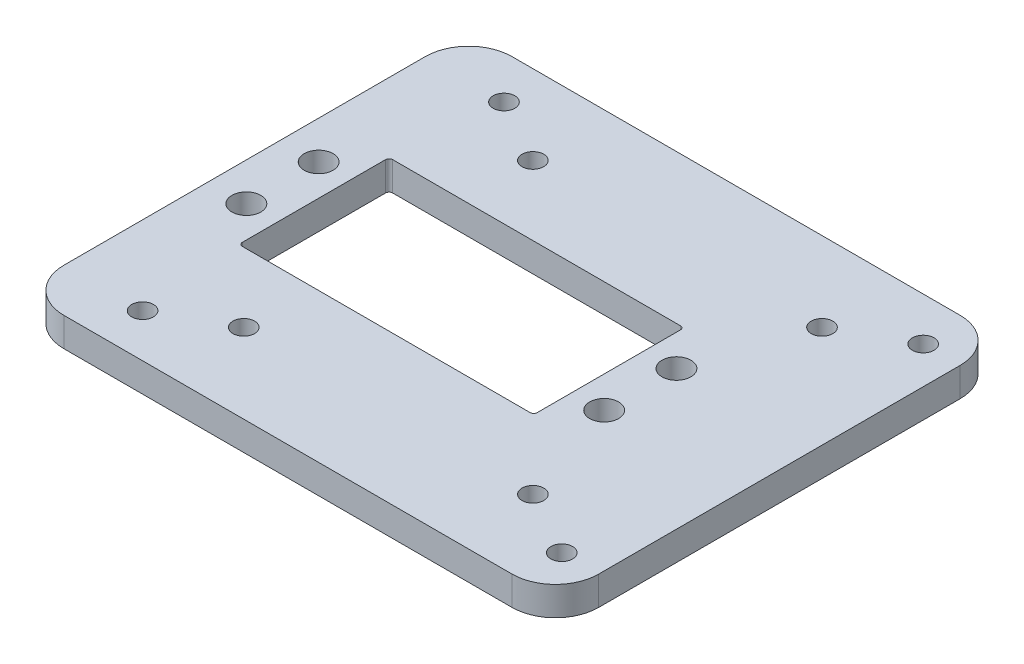
ISO-10303-21;
HEADER;
FILE_DESCRIPTION(('STEP AP214'),'2;1');
FILE_NAME('part.step','',(''),(''),'','','');
FILE_SCHEMA(('AUTOMOTIVE_DESIGN { 1 0 10303 214 1 1 1 1 }'));
ENDSEC;
DATA;
#1=APPLICATION_CONTEXT('core data for automotive mechanical design processes');
#2=APPLICATION_PROTOCOL_DEFINITION('international standard','automotive_design',2000,#1);
#3=PRODUCT_CONTEXT('',#1,'mechanical');
#4=PRODUCT('Part','Part','',(#3));
#5=PRODUCT_RELATED_PRODUCT_CATEGORY('part','',(#4));
#6=PRODUCT_DEFINITION_FORMATION('','',#4);
#7=PRODUCT_DEFINITION_CONTEXT('part definition',#1,'design');
#8=PRODUCT_DEFINITION('design','',#6,#7);
#9=PRODUCT_DEFINITION_SHAPE('','',#8);
#10=(LENGTH_UNIT() NAMED_UNIT(*) SI_UNIT(.MILLI.,.METRE.));
#11=(NAMED_UNIT(*) PLANE_ANGLE_UNIT() SI_UNIT($,.RADIAN.));
#12=(NAMED_UNIT(*) SI_UNIT($,.STERADIAN.) SOLID_ANGLE_UNIT());
#13=UNCERTAINTY_MEASURE_WITH_UNIT(LENGTH_MEASURE(1.E-05),#10,'distance_accuracy_value','');
#14=(GEOMETRIC_REPRESENTATION_CONTEXT(3) GLOBAL_UNCERTAINTY_ASSIGNED_CONTEXT((#13)) GLOBAL_UNIT_ASSIGNED_CONTEXT((#10,
#11,#12)) REPRESENTATION_CONTEXT('',''));
#15=CARTESIAN_POINT('',(0.,0.,0.));
#16=DIRECTION('',(0.,0.,1.));
#17=DIRECTION('',(1.,0.,0.));
#18=AXIS2_PLACEMENT_3D('',#15,#16,#17);
#19=CARTESIAN_POINT('',(20.4,4.,0.));
#20=DIRECTION('',(-1.,0.,0.));
#21=DIRECTION('',(0.,0.,1.));
#22=AXIS2_PLACEMENT_3D('',#19,#20,#21);
#23=PLANE('',#22);
#24=DIRECTION('',(0.,0.,-1.));
#25=VECTOR('',#24,1.);
#26=CARTESIAN_POINT('',(20.4,0.,0.));
#27=LINE('',#26,#25);
#28=CARTESIAN_POINT('',(20.4,0.,9.9));
#29=VERTEX_POINT('',#28);
#30=CARTESIAN_POINT('',(20.4,0.,-9.9));
#31=VERTEX_POINT('',#30);
#32=EDGE_CURVE('E179',#29,#31,#27,.T.);
#33=ORIENTED_EDGE('',*,*,#32,.F.);
#34=DIRECTION('',(0.,-1.,0.));
#35=VECTOR('',#34,1.);
#36=CARTESIAN_POINT('',(20.4,4.,9.9));
#37=LINE('',#36,#35);
#38=CARTESIAN_POINT('',(20.4,4.,9.9));
#39=VERTEX_POINT('',#38);
#40=EDGE_CURVE('E196',#29,#39,#37,.F.);
#41=ORIENTED_EDGE('',*,*,#40,.T.);
#42=DIRECTION('',(0.,0.,-1.));
#43=VECTOR('',#42,1.);
#44=CARTESIAN_POINT('',(20.4,4.,0.));
#45=LINE('',#44,#43);
#46=CARTESIAN_POINT('',(20.4,4.,-9.9));
#47=VERTEX_POINT('',#46);
#48=EDGE_CURVE('E338',#39,#47,#45,.T.);
#49=ORIENTED_EDGE('',*,*,#48,.T.);
#50=DIRECTION('',(0.,-1.,0.));
#51=VECTOR('',#50,1.);
#52=CARTESIAN_POINT('',(20.4,4.,-9.9));
#53=LINE('',#52,#51);
#54=EDGE_CURVE('E185',#47,#31,#53,.T.);
#55=ORIENTED_EDGE('',*,*,#54,.T.);
#56=EDGE_LOOP('',(#33,#41,#49,#55));
#57=FACE_BOUND('',#56,.T.);
#58=ADVANCED_FACE('F43',(#57),#23,.T.);
#59=CARTESIAN_POINT('',(0.,4.,10.4));
#60=DIRECTION('',(0.,0.,-1.));
#61=DIRECTION('',(-1.,0.,0.));
#62=AXIS2_PLACEMENT_3D('',#59,#60,#61);
#63=PLANE('',#62);
#64=DIRECTION('',(1.,0.,0.));
#65=VECTOR('',#64,1.);
#66=CARTESIAN_POINT('',(0.,4.,10.4));
#67=LINE('',#66,#65);
#68=CARTESIAN_POINT('',(-19.9,4.,10.4));
#69=VERTEX_POINT('',#68);
#70=CARTESIAN_POINT('',(19.9,4.,10.4));
#71=VERTEX_POINT('',#70);
#72=EDGE_CURVE('E341',#69,#71,#67,.T.);
#73=ORIENTED_EDGE('',*,*,#72,.T.);
#74=DIRECTION('',(0.,-1.,0.));
#75=VECTOR('',#74,1.);
#76=CARTESIAN_POINT('',(19.9,0.,10.4));
#77=LINE('',#76,#75);
#78=CARTESIAN_POINT('',(19.9,0.,10.4));
#79=VERTEX_POINT('',#78);
#80=EDGE_CURVE('E178',#71,#79,#77,.T.);
#81=ORIENTED_EDGE('',*,*,#80,.T.);
#82=DIRECTION('',(1.,0.,0.));
#83=VECTOR('',#82,1.);
#84=CARTESIAN_POINT('',(0.,0.,10.4));
#85=LINE('',#84,#83);
#86=CARTESIAN_POINT('',(-19.9,0.,10.4));
#87=VERTEX_POINT('',#86);
#88=EDGE_CURVE('E161',#87,#79,#85,.T.);
#89=ORIENTED_EDGE('',*,*,#88,.F.);
#90=DIRECTION('',(0.,-1.,0.));
#91=VECTOR('',#90,1.);
#92=CARTESIAN_POINT('',(-19.9,4.,10.4));
#93=LINE('',#92,#91);
#94=EDGE_CURVE('E175',#87,#69,#93,.F.);
#95=ORIENTED_EDGE('',*,*,#94,.T.);
#96=EDGE_LOOP('',(#73,#81,#89,#95));
#97=FACE_BOUND('',#96,.T.);
#98=ADVANCED_FACE('F174',(#97),#63,.T.);
#99=CARTESIAN_POINT('',(-20.4,4.,0.));
#100=DIRECTION('',(-1.,0.,0.));
#101=DIRECTION('',(0.,0.,1.));
#102=AXIS2_PLACEMENT_3D('',#99,#100,#101);
#103=PLANE('',#102);
#104=DIRECTION('',(0.,0.,-1.));
#105=VECTOR('',#104,1.);
#106=CARTESIAN_POINT('',(-20.4,4.,0.));
#107=LINE('',#106,#105);
#108=CARTESIAN_POINT('',(-20.4,4.,9.9));
#109=VERTEX_POINT('',#108);
#110=CARTESIAN_POINT('',(-20.4,4.,-9.9));
#111=VERTEX_POINT('',#110);
#112=EDGE_CURVE('E343',#109,#111,#107,.T.);
#113=ORIENTED_EDGE('',*,*,#112,.F.);
#114=DIRECTION('',(0.,-1.,0.));
#115=VECTOR('',#114,1.);
#116=CARTESIAN_POINT('',(-20.4,4.,9.9));
#117=LINE('',#116,#115);
#118=CARTESIAN_POINT('',(-20.4,0.,9.9));
#119=VERTEX_POINT('',#118);
#120=EDGE_CURVE('E200',#109,#119,#117,.T.);
#121=ORIENTED_EDGE('',*,*,#120,.T.);
#122=DIRECTION('',(0.,0.,-1.));
#123=VECTOR('',#122,1.);
#124=CARTESIAN_POINT('',(-20.4,0.,0.));
#125=LINE('',#124,#123);
#126=CARTESIAN_POINT('',(-20.4,0.,-9.9));
#127=VERTEX_POINT('',#126);
#128=EDGE_CURVE('E163',#119,#127,#125,.T.);
#129=ORIENTED_EDGE('',*,*,#128,.T.);
#130=DIRECTION('',(0.,-1.,0.));
#131=VECTOR('',#130,1.);
#132=CARTESIAN_POINT('',(-20.4,4.,-9.9));
#133=LINE('',#132,#131);
#134=EDGE_CURVE('E198',#127,#111,#133,.F.);
#135=ORIENTED_EDGE('',*,*,#134,.T.);
#136=EDGE_LOOP('',(#113,#121,#129,#135));
#137=FACE_BOUND('',#136,.T.);
#138=ADVANCED_FACE('F407',(#137),#103,.F.);
#139=CARTESIAN_POINT('',(44.,4.,0.));
#140=DIRECTION('',(1.,0.,0.));
#141=DIRECTION('',(0.,0.,-1.));
#142=AXIS2_PLACEMENT_3D('',#139,#140,#141);
#143=PLANE('',#142);
#144=DIRECTION('',(0.,0.,1.));
#145=VECTOR('',#144,1.);
#146=CARTESIAN_POINT('',(44.,0.,0.));
#147=LINE('',#146,#145);
#148=CARTESIAN_POINT('',(44.,0.,-25.));
#149=VERTEX_POINT('',#148);
#150=CARTESIAN_POINT('',(44.,0.,25.));
#151=VERTEX_POINT('',#150);
#152=EDGE_CURVE('E269',#149,#151,#147,.T.);
#153=ORIENTED_EDGE('',*,*,#152,.F.);
#154=DIRECTION('',(0.,-1.,0.));
#155=VECTOR('',#154,1.);
#156=CARTESIAN_POINT('',(44.,4.,-25.));
#157=LINE('',#156,#155);
#158=CARTESIAN_POINT('',(44.,4.,-25.));
#159=VERTEX_POINT('',#158);
#160=EDGE_CURVE('E235',#149,#159,#157,.F.);
#161=ORIENTED_EDGE('',*,*,#160,.T.);
#162=DIRECTION('',(0.,0.,1.));
#163=VECTOR('',#162,1.);
#164=CARTESIAN_POINT('',(44.,4.,0.));
#165=LINE('',#164,#163);
#166=CARTESIAN_POINT('',(44.,4.,25.));
#167=VERTEX_POINT('',#166);
#168=EDGE_CURVE('E313',#159,#167,#165,.T.);
#169=ORIENTED_EDGE('',*,*,#168,.T.);
#170=DIRECTION('',(0.,-1.,0.));
#171=VECTOR('',#170,1.);
#172=CARTESIAN_POINT('',(44.,0.,25.));
#173=LINE('',#172,#171);
#174=EDGE_CURVE('E232',#167,#151,#173,.T.);
#175=ORIENTED_EDGE('',*,*,#174,.T.);
#176=EDGE_LOOP('',(#153,#161,#169,#175));
#177=FACE_BOUND('',#176,.T.);
#178=ADVANCED_FACE('F372',(#177),#143,.T.);
#179=CARTESIAN_POINT('',(0.,4.,-31.));
#180=DIRECTION('',(0.,0.,-1.));
#181=DIRECTION('',(-1.,0.,0.));
#182=AXIS2_PLACEMENT_3D('',#179,#180,#181);
#183=PLANE('',#182);
#184=DIRECTION('',(1.,0.,0.));
#185=VECTOR('',#184,1.);
#186=CARTESIAN_POINT('',(0.,4.,-31.));
#187=LINE('',#186,#185);
#188=CARTESIAN_POINT('',(-24.,4.,-31.));
#189=VERTEX_POINT('',#188);
#190=CARTESIAN_POINT('',(38.,4.,-31.));
#191=VERTEX_POINT('',#190);
#192=EDGE_CURVE('E318',#189,#191,#187,.T.);
#193=ORIENTED_EDGE('',*,*,#192,.T.);
#194=DIRECTION('',(0.,-1.,0.));
#195=VECTOR('',#194,1.);
#196=CARTESIAN_POINT('',(38.,4.,-31.));
#197=LINE('',#196,#195);
#198=CARTESIAN_POINT('',(38.,0.,-31.));
#199=VERTEX_POINT('',#198);
#200=EDGE_CURVE('E221',#191,#199,#197,.T.);
#201=ORIENTED_EDGE('',*,*,#200,.T.);
#202=DIRECTION('',(1.,0.,0.));
#203=VECTOR('',#202,1.);
#204=CARTESIAN_POINT('',(0.,0.,-31.));
#205=LINE('',#204,#203);
#206=CARTESIAN_POINT('',(-24.,0.,-31.));
#207=VERTEX_POINT('',#206);
#208=EDGE_CURVE('E265',#207,#199,#205,.T.);
#209=ORIENTED_EDGE('',*,*,#208,.F.);
#210=DIRECTION('',(0.,-1.,0.));
#211=VECTOR('',#210,1.);
#212=CARTESIAN_POINT('',(-24.,4.,-31.));
#213=LINE('',#212,#211);
#214=EDGE_CURVE('E219',#207,#189,#213,.F.);
#215=ORIENTED_EDGE('',*,*,#214,.T.);
#216=EDGE_LOOP('',(#193,#201,#209,#215));
#217=FACE_BOUND('',#216,.T.);
#218=ADVANCED_FACE('F383',(#217),#183,.T.);
#219=CARTESIAN_POINT('',(-30.,4.,0.));
#220=DIRECTION('',(-1.,0.,0.));
#221=DIRECTION('',(0.,0.,1.));
#222=AXIS2_PLACEMENT_3D('',#219,#220,#221);
#223=PLANE('',#222);
#224=DIRECTION('',(0.,0.,-1.));
#225=VECTOR('',#224,1.);
#226=CARTESIAN_POINT('',(-30.,0.,0.));
#227=LINE('',#226,#225);
#228=CARTESIAN_POINT('',(-30.,0.,25.));
#229=VERTEX_POINT('',#228);
#230=CARTESIAN_POINT('',(-30.,0.,-25.));
#231=VERTEX_POINT('',#230);
#232=EDGE_CURVE('E254',#229,#231,#227,.T.);
#233=ORIENTED_EDGE('',*,*,#232,.F.);
#234=DIRECTION('',(0.,-1.,0.));
#235=VECTOR('',#234,1.);
#236=CARTESIAN_POINT('',(-30.,4.,25.));
#237=LINE('',#236,#235);
#238=CARTESIAN_POINT('',(-30.,4.,25.));
#239=VERTEX_POINT('',#238);
#240=EDGE_CURVE('E11',#229,#239,#237,.F.);
#241=ORIENTED_EDGE('',*,*,#240,.T.);
#242=DIRECTION('',(0.,0.,-1.));
#243=VECTOR('',#242,1.);
#244=CARTESIAN_POINT('',(-30.,4.,0.));
#245=LINE('',#244,#243);
#246=CARTESIAN_POINT('',(-30.,4.,-25.));
#247=VERTEX_POINT('',#246);
#248=EDGE_CURVE('E256',#239,#247,#245,.T.);
#249=ORIENTED_EDGE('',*,*,#248,.T.);
#250=DIRECTION('',(0.,-1.,0.));
#251=VECTOR('',#250,1.);
#252=CARTESIAN_POINT('',(-30.,4.,-25.));
#253=LINE('',#252,#251);
#254=EDGE_CURVE('E51',#247,#231,#253,.T.);
#255=ORIENTED_EDGE('',*,*,#254,.T.);
#256=EDGE_LOOP('',(#233,#241,#249,#255));
#257=FACE_BOUND('',#256,.T.);
#258=ADVANCED_FACE('F253',(#257),#223,.T.);
#259=CARTESIAN_POINT('',(38.89,4.,25.));
#260=DIRECTION('',(0.,-1.,0.));
#261=DIRECTION('',(0.,0.,-1.));
#262=AXIS2_PLACEMENT_3D('',#259,#260,#261);
#263=CYLINDRICAL_SURFACE('',#262,1.5);
#264=CARTESIAN_POINT('',(38.89,4.,25.));
#265=DIRECTION('',(0.,1.,0.));
#266=DIRECTION('',(0.,0.,1.));
#267=AXIS2_PLACEMENT_3D('',#264,#265,#266);
#268=CIRCLE('',#267,1.5);
#269=CARTESIAN_POINT('',(38.89,4.,26.5));
#270=VERTEX_POINT('',#269);
#271=EDGE_CURVE('E188',#270,#270,#268,.T.);
#272=ORIENTED_EDGE('',*,*,#271,.T.);
#273=EDGE_LOOP('',(#272));
#274=FACE_BOUND('',#273,.T.);
#275=CARTESIAN_POINT('',(38.89,0.,25.));
#276=DIRECTION('',(0.,1.,0.));
#277=DIRECTION('',(0.,0.,1.));
#278=AXIS2_PLACEMENT_3D('',#275,#276,#277);
#279=CIRCLE('',#278,1.5);
#280=CARTESIAN_POINT('',(38.89,0.,26.5));
#281=VERTEX_POINT('',#280);
#282=EDGE_CURVE('E304',#281,#281,#279,.T.);
#283=ORIENTED_EDGE('',*,*,#282,.F.);
#284=EDGE_LOOP('',(#283));
#285=FACE_BOUND('',#284,.T.);
#286=ADVANCED_FACE('F434',(#274,#285),#263,.F.);
#287=CARTESIAN_POINT('',(-10.11,4.,20.));
#288=DIRECTION('',(0.,-1.,0.));
#289=DIRECTION('',(0.,0.,-1.));
#290=AXIS2_PLACEMENT_3D('',#287,#288,#289);
#291=CYLINDRICAL_SURFACE('',#290,1.5);
#292=CARTESIAN_POINT('',(-10.11,4.,20.));
#293=DIRECTION('',(0.,1.,0.));
#294=DIRECTION('',(0.,0.,1.));
#295=AXIS2_PLACEMENT_3D('',#292,#293,#294);
#296=CIRCLE('',#295,1.5);
#297=CARTESIAN_POINT('',(-10.11,4.,21.5));
#298=VERTEX_POINT('',#297);
#299=EDGE_CURVE('E361',#298,#298,#296,.F.);
#300=ORIENTED_EDGE('',*,*,#299,.F.);
#301=EDGE_LOOP('',(#300));
#302=FACE_BOUND('',#301,.T.);
#303=CARTESIAN_POINT('',(-10.11,0.,20.));
#304=DIRECTION('',(0.,1.,0.));
#305=DIRECTION('',(0.,0.,1.));
#306=AXIS2_PLACEMENT_3D('',#303,#304,#305);
#307=CIRCLE('',#306,1.5);
#308=CARTESIAN_POINT('',(-10.11,0.,21.5));
#309=VERTEX_POINT('',#308);
#310=EDGE_CURVE('E302',#309,#309,#307,.F.);
#311=ORIENTED_EDGE('',*,*,#310,.T.);
#312=EDGE_LOOP('',(#311));
#313=FACE_BOUND('',#312,.T.);
#314=ADVANCED_FACE('F494',(#302,#313),#291,.F.);
#315=CARTESIAN_POINT('',(29.89,4.,20.));
#316=DIRECTION('',(0.,-1.,0.));
#317=DIRECTION('',(0.,0.,-1.));
#318=AXIS2_PLACEMENT_3D('',#315,#316,#317);
#319=CYLINDRICAL_SURFACE('',#318,1.5);
#320=CARTESIAN_POINT('',(29.89,4.,20.));
#321=DIRECTION('',(0.,1.,0.));
#322=DIRECTION('',(0.,0.,1.));
#323=AXIS2_PLACEMENT_3D('',#320,#321,#322);
#324=CIRCLE('',#323,1.5);
#325=CARTESIAN_POINT('',(29.89,4.,21.5));
#326=VERTEX_POINT('',#325);
#327=EDGE_CURVE('E358',#326,#326,#324,.T.);
#328=ORIENTED_EDGE('',*,*,#327,.T.);
#329=EDGE_LOOP('',(#328));
#330=FACE_BOUND('',#329,.T.);
#331=CARTESIAN_POINT('',(29.89,0.,20.));
#332=DIRECTION('',(0.,1.,0.));
#333=DIRECTION('',(0.,0.,1.));
#334=AXIS2_PLACEMENT_3D('',#331,#332,#333);
#335=CIRCLE('',#334,1.5);
#336=CARTESIAN_POINT('',(29.89,0.,21.5));
#337=VERTEX_POINT('',#336);
#338=EDGE_CURVE('E299',#337,#337,#335,.T.);
#339=ORIENTED_EDGE('',*,*,#338,.F.);
#340=EDGE_LOOP('',(#339));
#341=FACE_BOUND('',#340,.T.);
#342=ADVANCED_FACE('F490',(#330,#341),#319,.F.);
#343=CARTESIAN_POINT('',(-10.11,4.,-20.));
#344=DIRECTION('',(0.,-1.,0.));
#345=DIRECTION('',(0.,0.,-1.));
#346=AXIS2_PLACEMENT_3D('',#343,#344,#345);
#347=CYLINDRICAL_SURFACE('',#346,1.5);
#348=CARTESIAN_POINT('',(-10.11,4.,-20.));
#349=DIRECTION('',(0.,1.,0.));
#350=DIRECTION('',(0.,0.,1.));
#351=AXIS2_PLACEMENT_3D('',#348,#349,#350);
#352=CIRCLE('',#351,1.5);
#353=CARTESIAN_POINT('',(-10.11,4.,-18.5));
#354=VERTEX_POINT('',#353);
#355=EDGE_CURVE('E355',#354,#354,#352,.T.);
#356=ORIENTED_EDGE('',*,*,#355,.T.);
#357=EDGE_LOOP('',(#356));
#358=FACE_BOUND('',#357,.T.);
#359=CARTESIAN_POINT('',(-10.11,0.,-20.));
#360=DIRECTION('',(0.,1.,0.));
#361=DIRECTION('',(0.,0.,1.));
#362=AXIS2_PLACEMENT_3D('',#359,#360,#361);
#363=CIRCLE('',#362,1.5);
#364=CARTESIAN_POINT('',(-10.11,0.,-18.5));
#365=VERTEX_POINT('',#364);
#366=EDGE_CURVE('E296',#365,#365,#363,.T.);
#367=ORIENTED_EDGE('',*,*,#366,.F.);
#368=EDGE_LOOP('',(#367));
#369=FACE_BOUND('',#368,.T.);
#370=ADVANCED_FACE('F486',(#358,#369),#347,.F.);
#371=CARTESIAN_POINT('',(-24.75,4.,-5.00000000000001));
#372=DIRECTION('',(0.,-1.,0.));
#373=DIRECTION('',(0.,0.,-1.));
#374=AXIS2_PLACEMENT_3D('',#371,#372,#373);
#375=CYLINDRICAL_SURFACE('',#374,2.);
#376=CARTESIAN_POINT('',(-24.75,4.,-5.00000000000001));
#377=DIRECTION('',(0.,1.,0.));
#378=DIRECTION('',(0.,0.,1.));
#379=AXIS2_PLACEMENT_3D('',#376,#377,#378);
#380=CIRCLE('',#379,2.);
#381=CARTESIAN_POINT('',(-24.75,4.,-3.));
#382=VERTEX_POINT('',#381);
#383=EDGE_CURVE('E352',#382,#382,#380,.F.);
#384=ORIENTED_EDGE('',*,*,#383,.F.);
#385=EDGE_LOOP('',(#384));
#386=FACE_BOUND('',#385,.T.);
#387=CARTESIAN_POINT('',(-24.75,0.,-5.00000000000001));
#388=DIRECTION('',(0.,1.,0.));
#389=DIRECTION('',(0.,0.,1.));
#390=AXIS2_PLACEMENT_3D('',#387,#388,#389);
#391=CIRCLE('',#390,2.);
#392=CARTESIAN_POINT('',(-24.75,0.,-3.));
#393=VERTEX_POINT('',#392);
#394=EDGE_CURVE('E293',#393,#393,#391,.F.);
#395=ORIENTED_EDGE('',*,*,#394,.T.);
#396=EDGE_LOOP('',(#395));
#397=FACE_BOUND('',#396,.T.);
#398=ADVANCED_FACE('F482',(#386,#397),#375,.F.);
#399=CARTESIAN_POINT('',(-24.75,4.,4.99999999999999));
#400=DIRECTION('',(0.,-1.,0.));
#401=DIRECTION('',(0.,0.,-1.));
#402=AXIS2_PLACEMENT_3D('',#399,#400,#401);
#403=CYLINDRICAL_SURFACE('',#402,2.);
#404=CARTESIAN_POINT('',(-24.75,4.,4.99999999999999));
#405=DIRECTION('',(0.,1.,0.));
#406=DIRECTION('',(0.,0.,1.));
#407=AXIS2_PLACEMENT_3D('',#404,#405,#406);
#408=CIRCLE('',#407,2.);
#409=CARTESIAN_POINT('',(-24.75,4.,7.));
#410=VERTEX_POINT('',#409);
#411=EDGE_CURVE('E349',#410,#410,#408,.T.);
#412=ORIENTED_EDGE('',*,*,#411,.T.);
#413=EDGE_LOOP('',(#412));
#414=FACE_BOUND('',#413,.T.);
#415=CARTESIAN_POINT('',(-24.75,0.,4.99999999999999));
#416=DIRECTION('',(0.,1.,0.));
#417=DIRECTION('',(0.,0.,1.));
#418=AXIS2_PLACEMENT_3D('',#415,#416,#417);
#419=CIRCLE('',#418,2.);
#420=CARTESIAN_POINT('',(-24.75,0.,7.));
#421=VERTEX_POINT('',#420);
#422=EDGE_CURVE('E290',#421,#421,#419,.T.);
#423=ORIENTED_EDGE('',*,*,#422,.F.);
#424=EDGE_LOOP('',(#423));
#425=FACE_BOUND('',#424,.T.);
#426=ADVANCED_FACE('F479',(#414,#425),#403,.F.);
#427=CARTESIAN_POINT('',(0.,4.,-10.4));
#428=DIRECTION('',(0.,0.,-1.));
#429=DIRECTION('',(-1.,0.,0.));
#430=AXIS2_PLACEMENT_3D('',#427,#428,#429);
#431=PLANE('',#430);
#432=DIRECTION('',(1.,0.,0.));
#433=VECTOR('',#432,1.);
#434=CARTESIAN_POINT('',(0.,0.,-10.4));
#435=LINE('',#434,#433);
#436=CARTESIAN_POINT('',(-19.9,0.,-10.4));
#437=VERTEX_POINT('',#436);
#438=CARTESIAN_POINT('',(19.9,0.,-10.4));
#439=VERTEX_POINT('',#438);
#440=EDGE_CURVE('E287',#437,#439,#435,.T.);
#441=ORIENTED_EDGE('',*,*,#440,.T.);
#442=DIRECTION('',(0.,-1.,0.));
#443=VECTOR('',#442,1.);
#444=CARTESIAN_POINT('',(19.9,4.,-10.4));
#445=LINE('',#444,#443);
#446=CARTESIAN_POINT('',(19.9,4.,-10.4));
#447=VERTEX_POINT('',#446);
#448=EDGE_CURVE('E205',#439,#447,#445,.F.);
#449=ORIENTED_EDGE('',*,*,#448,.T.);
#450=DIRECTION('',(1.,0.,0.));
#451=VECTOR('',#450,1.);
#452=CARTESIAN_POINT('',(0.,4.,-10.4));
#453=LINE('',#452,#451);
#454=CARTESIAN_POINT('',(-19.9,4.,-10.4));
#455=VERTEX_POINT('',#454);
#456=EDGE_CURVE('E346',#455,#447,#453,.T.);
#457=ORIENTED_EDGE('',*,*,#456,.F.);
#458=DIRECTION('',(0.,-1.,0.));
#459=VECTOR('',#458,1.);
#460=CARTESIAN_POINT('',(-19.9,0.,-10.4));
#461=LINE('',#460,#459);
#462=EDGE_CURVE('E202',#455,#437,#461,.T.);
#463=ORIENTED_EDGE('',*,*,#462,.T.);
#464=EDGE_LOOP('',(#441,#449,#457,#463));
#465=FACE_BOUND('',#464,.T.);
#466=ADVANCED_FACE('F416',(#465),#431,.F.);
#467=CARTESIAN_POINT('',(24.75,4.,-5.00000000000001));
#468=DIRECTION('',(0.,-1.,0.));
#469=DIRECTION('',(0.,0.,-1.));
#470=AXIS2_PLACEMENT_3D('',#467,#468,#469);
#471=CYLINDRICAL_SURFACE('',#470,2.);
#472=CARTESIAN_POINT('',(24.75,4.,-5.00000000000001));
#473=DIRECTION('',(0.,1.,0.));
#474=DIRECTION('',(0.,0.,1.));
#475=AXIS2_PLACEMENT_3D('',#472,#473,#474);
#476=CIRCLE('',#475,2.);
#477=CARTESIAN_POINT('',(24.75,4.,-3.));
#478=VERTEX_POINT('',#477);
#479=EDGE_CURVE('E335',#478,#478,#476,.T.);
#480=ORIENTED_EDGE('',*,*,#479,.T.);
#481=EDGE_LOOP('',(#480));
#482=FACE_BOUND('',#481,.T.);
#483=CARTESIAN_POINT('',(24.75,0.,-5.00000000000001));
#484=DIRECTION('',(0.,1.,0.));
#485=DIRECTION('',(0.,0.,1.));
#486=AXIS2_PLACEMENT_3D('',#483,#484,#485);
#487=CIRCLE('',#486,2.);
#488=CARTESIAN_POINT('',(24.75,0.,-3.));
#489=VERTEX_POINT('',#488);
#490=EDGE_CURVE('E281',#489,#489,#487,.T.);
#491=ORIENTED_EDGE('',*,*,#490,.F.);
#492=EDGE_LOOP('',(#491));
#493=FACE_BOUND('',#492,.T.);
#494=ADVANCED_FACE('F412',(#482,#493),#471,.F.);
#495=CARTESIAN_POINT('',(24.75,4.,4.99999999999999));
#496=DIRECTION('',(0.,-1.,0.));
#497=DIRECTION('',(0.,0.,-1.));
#498=AXIS2_PLACEMENT_3D('',#495,#496,#497);
#499=CYLINDRICAL_SURFACE('',#498,2.);
#500=CARTESIAN_POINT('',(24.75,4.,4.99999999999999));
#501=DIRECTION('',(0.,1.,0.));
#502=DIRECTION('',(0.,0.,1.));
#503=AXIS2_PLACEMENT_3D('',#500,#501,#502);
#504=CIRCLE('',#503,2.);
#505=CARTESIAN_POINT('',(24.75,4.,7.));
#506=VERTEX_POINT('',#505);
#507=EDGE_CURVE('E332',#506,#506,#504,.F.);
#508=ORIENTED_EDGE('',*,*,#507,.F.);
#509=EDGE_LOOP('',(#508));
#510=FACE_BOUND('',#509,.T.);
#511=CARTESIAN_POINT('',(24.75,0.,4.99999999999999));
#512=DIRECTION('',(0.,1.,0.));
#513=DIRECTION('',(0.,0.,1.));
#514=AXIS2_PLACEMENT_3D('',#511,#512,#513);
#515=CIRCLE('',#514,2.);
#516=CARTESIAN_POINT('',(24.75,0.,7.));
#517=VERTEX_POINT('',#516);
#518=EDGE_CURVE('E278',#517,#517,#515,.F.);
#519=ORIENTED_EDGE('',*,*,#518,.T.);
#520=EDGE_LOOP('',(#519));
#521=FACE_BOUND('',#520,.T.);
#522=ADVANCED_FACE('F415',(#510,#521),#499,.F.);
#523=CARTESIAN_POINT('',(-19.11,4.,-25.));
#524=DIRECTION('',(0.,-1.,0.));
#525=DIRECTION('',(0.,0.,-1.));
#526=AXIS2_PLACEMENT_3D('',#523,#524,#525);
#527=CYLINDRICAL_SURFACE('',#526,1.5);
#528=CARTESIAN_POINT('',(-19.11,4.,-25.));
#529=DIRECTION('',(0.,1.,0.));
#530=DIRECTION('',(0.,0.,1.));
#531=AXIS2_PLACEMENT_3D('',#528,#529,#530);
#532=CIRCLE('',#531,1.5);
#533=CARTESIAN_POINT('',(-19.11,4.,-23.5));
#534=VERTEX_POINT('',#533);
#535=EDGE_CURVE('E329',#534,#534,#532,.T.);
#536=ORIENTED_EDGE('',*,*,#535,.T.);
#537=EDGE_LOOP('',(#536));
#538=FACE_BOUND('',#537,.T.);
#539=CARTESIAN_POINT('',(-19.11,0.,-25.));
#540=DIRECTION('',(0.,1.,0.));
#541=DIRECTION('',(0.,0.,1.));
#542=AXIS2_PLACEMENT_3D('',#539,#540,#541);
#543=CIRCLE('',#542,1.5);
#544=CARTESIAN_POINT('',(-19.11,0.,-23.5));
#545=VERTEX_POINT('',#544);
#546=EDGE_CURVE('E275',#545,#545,#543,.T.);
#547=ORIENTED_EDGE('',*,*,#546,.F.);
#548=EDGE_LOOP('',(#547));
#549=FACE_BOUND('',#548,.T.);
#550=ADVANCED_FACE('F420',(#538,#549),#527,.F.);
#551=CARTESIAN_POINT('',(-19.11,4.,25.));
#552=DIRECTION('',(0.,-1.,0.));
#553=DIRECTION('',(0.,0.,-1.));
#554=AXIS2_PLACEMENT_3D('',#551,#552,#553);
#555=CYLINDRICAL_SURFACE('',#554,1.5);
#556=CARTESIAN_POINT('',(-19.11,4.,25.));
#557=DIRECTION('',(0.,1.,0.));
#558=DIRECTION('',(0.,0.,1.));
#559=AXIS2_PLACEMENT_3D('',#556,#557,#558);
#560=CIRCLE('',#559,1.5);
#561=CARTESIAN_POINT('',(-19.11,4.,26.5));
#562=VERTEX_POINT('',#561);
#563=EDGE_CURVE('E326',#562,#562,#560,.F.);
#564=ORIENTED_EDGE('',*,*,#563,.F.);
#565=EDGE_LOOP('',(#564));
#566=FACE_BOUND('',#565,.T.);
#567=CARTESIAN_POINT('',(-19.11,0.,25.));
#568=DIRECTION('',(0.,1.,0.));
#569=DIRECTION('',(0.,0.,1.));
#570=AXIS2_PLACEMENT_3D('',#567,#568,#569);
#571=CIRCLE('',#570,1.5);
#572=CARTESIAN_POINT('',(-19.11,0.,26.5));
#573=VERTEX_POINT('',#572);
#574=EDGE_CURVE('E267',#573,#573,#571,.F.);
#575=ORIENTED_EDGE('',*,*,#574,.T.);
#576=EDGE_LOOP('',(#575));
#577=FACE_BOUND('',#576,.T.);
#578=ADVANCED_FACE('F424',(#566,#577),#555,.F.);
#579=CARTESIAN_POINT('',(0.,4.,31.));
#580=DIRECTION('',(0.,0.,-1.));
#581=DIRECTION('',(-1.,0.,0.));
#582=AXIS2_PLACEMENT_3D('',#579,#580,#581);
#583=PLANE('',#582);
#584=DIRECTION('',(1.,0.,0.));
#585=VECTOR('',#584,1.);
#586=CARTESIAN_POINT('',(0.,0.,31.));
#587=LINE('',#586,#585);
#588=CARTESIAN_POINT('',(-24.,0.,31.));
#589=VERTEX_POINT('',#588);
#590=CARTESIAN_POINT('',(38.,0.,31.));
#591=VERTEX_POINT('',#590);
#592=EDGE_CURVE('E264',#589,#591,#587,.T.);
#593=ORIENTED_EDGE('',*,*,#592,.T.);
#594=DIRECTION('',(0.,-1.,0.));
#595=VECTOR('',#594,1.);
#596=CARTESIAN_POINT('',(38.,4.,31.));
#597=LINE('',#596,#595);
#598=CARTESIAN_POINT('',(38.,4.,31.));
#599=VERTEX_POINT('',#598);
#600=EDGE_CURVE('E58',#591,#599,#597,.F.);
#601=ORIENTED_EDGE('',*,*,#600,.T.);
#602=DIRECTION('',(1.,0.,0.));
#603=VECTOR('',#602,1.);
#604=CARTESIAN_POINT('',(0.,4.,31.));
#605=LINE('',#604,#603);
#606=CARTESIAN_POINT('',(-24.,4.,31.));
#607=VERTEX_POINT('',#606);
#608=EDGE_CURVE('E324',#607,#599,#605,.T.);
#609=ORIENTED_EDGE('',*,*,#608,.F.);
#610=DIRECTION('',(0.,-1.,0.));
#611=VECTOR('',#610,1.);
#612=CARTESIAN_POINT('',(-24.,0.,31.));
#613=LINE('',#612,#611);
#614=EDGE_CURVE('E244',#607,#589,#613,.T.);
#615=ORIENTED_EDGE('',*,*,#614,.T.);
#616=EDGE_LOOP('',(#593,#601,#609,#615));
#617=FACE_BOUND('',#616,.T.);
#618=ADVANCED_FACE('F388',(#617),#583,.F.);
#619=CARTESIAN_POINT('',(29.89,4.,-20.));
#620=DIRECTION('',(0.,-1.,0.));
#621=DIRECTION('',(0.,0.,-1.));
#622=AXIS2_PLACEMENT_3D('',#619,#620,#621);
#623=CYLINDRICAL_SURFACE('',#622,1.5);
#624=CARTESIAN_POINT('',(29.89,4.,-20.));
#625=DIRECTION('',(0.,1.,0.));
#626=DIRECTION('',(0.,0.,1.));
#627=AXIS2_PLACEMENT_3D('',#624,#625,#626);
#628=CIRCLE('',#627,1.5);
#629=CARTESIAN_POINT('',(29.89,4.,-18.5));
#630=VERTEX_POINT('',#629);
#631=EDGE_CURVE('E309',#630,#630,#628,.F.);
#632=ORIENTED_EDGE('',*,*,#631,.F.);
#633=EDGE_LOOP('',(#632));
#634=FACE_BOUND('',#633,.T.);
#635=CARTESIAN_POINT('',(29.89,0.,-20.));
#636=DIRECTION('',(0.,1.,0.));
#637=DIRECTION('',(0.,0.,1.));
#638=AXIS2_PLACEMENT_3D('',#635,#636,#637);
#639=CIRCLE('',#638,1.5);
#640=CARTESIAN_POINT('',(29.89,0.,-18.5));
#641=VERTEX_POINT('',#640);
#642=EDGE_CURVE('E366',#641,#641,#639,.F.);
#643=ORIENTED_EDGE('',*,*,#642,.T.);
#644=EDGE_LOOP('',(#643));
#645=FACE_BOUND('',#644,.T.);
#646=ADVANCED_FACE('F431',(#634,#645),#623,.F.);
#647=CARTESIAN_POINT('',(38.89,4.,-25.));
#648=DIRECTION('',(0.,-1.,0.));
#649=DIRECTION('',(0.,0.,-1.));
#650=AXIS2_PLACEMENT_3D('',#647,#648,#649);
#651=CYLINDRICAL_SURFACE('',#650,1.5);
#652=CARTESIAN_POINT('',(38.89,4.,-25.));
#653=DIRECTION('',(0.,1.,0.));
#654=DIRECTION('',(0.,0.,1.));
#655=AXIS2_PLACEMENT_3D('',#652,#653,#654);
#656=CIRCLE('',#655,1.5);
#657=CARTESIAN_POINT('',(38.89,4.,-23.5));
#658=VERTEX_POINT('',#657);
#659=EDGE_CURVE('E183',#658,#658,#656,.F.);
#660=ORIENTED_EDGE('',*,*,#659,.F.);
#661=EDGE_LOOP('',(#660));
#662=FACE_BOUND('',#661,.T.);
#663=CARTESIAN_POINT('',(38.89,0.,-25.));
#664=DIRECTION('',(0.,1.,0.));
#665=DIRECTION('',(0.,0.,1.));
#666=AXIS2_PLACEMENT_3D('',#663,#664,#665);
#667=CIRCLE('',#666,1.5);
#668=CARTESIAN_POINT('',(38.89,0.,-23.5));
#669=VERTEX_POINT('',#668);
#670=EDGE_CURVE('E191',#669,#669,#667,.F.);
#671=ORIENTED_EDGE('',*,*,#670,.T.);
#672=EDGE_LOOP('',(#671));
#673=FACE_BOUND('',#672,.T.);
#674=ADVANCED_FACE('F441',(#662,#673),#651,.F.);
#675=CARTESIAN_POINT('',(0.,4.,0.));
#676=DIRECTION('',(0.,1.,0.));
#677=DIRECTION('',(0.,0.,1.));
#678=AXIS2_PLACEMENT_3D('',#675,#676,#677);
#679=PLANE('',#678);
#680=ORIENTED_EDGE('',*,*,#631,.T.);
#681=EDGE_LOOP('',(#680));
#682=FACE_BOUND('',#681,.T.);
#683=ORIENTED_EDGE('',*,*,#168,.F.);
#684=CARTESIAN_POINT('',(38.,4.,-25.));
#685=DIRECTION('',(0.,1.,0.));
#686=DIRECTION('',(0.,0.,1.));
#687=AXIS2_PLACEMENT_3D('',#684,#685,#686);
#688=CIRCLE('',#687,6.);
#689=EDGE_CURVE('E242',#159,#191,#688,.T.);
#690=ORIENTED_EDGE('',*,*,#689,.T.);
#691=ORIENTED_EDGE('',*,*,#192,.F.);
#692=CARTESIAN_POINT('',(-24.,4.,-25.));
#693=DIRECTION('',(0.,1.,0.));
#694=DIRECTION('',(0.,0.,1.));
#695=AXIS2_PLACEMENT_3D('',#692,#693,#694);
#696=CIRCLE('',#695,6.);
#697=EDGE_CURVE('E237',#189,#247,#696,.T.);
#698=ORIENTED_EDGE('',*,*,#697,.T.);
#699=ORIENTED_EDGE('',*,*,#248,.F.);
#700=CARTESIAN_POINT('',(-24.,4.,25.));
#701=DIRECTION('',(0.,1.,0.));
#702=DIRECTION('',(0.,0.,1.));
#703=AXIS2_PLACEMENT_3D('',#700,#701,#702);
#704=CIRCLE('',#703,6.);
#705=EDGE_CURVE('E65',#239,#607,#704,.T.);
#706=ORIENTED_EDGE('',*,*,#705,.T.);
#707=ORIENTED_EDGE('',*,*,#608,.T.);
#708=CARTESIAN_POINT('',(38.,4.,25.));
#709=DIRECTION('',(0.,1.,0.));
#710=DIRECTION('',(0.,0.,1.));
#711=AXIS2_PLACEMENT_3D('',#708,#709,#710);
#712=CIRCLE('',#711,6.);
#713=EDGE_CURVE('E240',#599,#167,#712,.T.);
#714=ORIENTED_EDGE('',*,*,#713,.T.);
#715=EDGE_LOOP('',(#683,#690,#691,#698,#699,#706,#707,#714));
#716=FACE_BOUND('',#715,.T.);
#717=ORIENTED_EDGE('',*,*,#563,.T.);
#718=EDGE_LOOP('',(#717));
#719=FACE_BOUND('',#718,.T.);
#720=ORIENTED_EDGE('',*,*,#535,.F.);
#721=EDGE_LOOP('',(#720));
#722=FACE_BOUND('',#721,.T.);
#723=ORIENTED_EDGE('',*,*,#507,.T.);
#724=EDGE_LOOP('',(#723));
#725=FACE_BOUND('',#724,.T.);
#726=ORIENTED_EDGE('',*,*,#479,.F.);
#727=EDGE_LOOP('',(#726));
#728=FACE_BOUND('',#727,.T.);
#729=ORIENTED_EDGE('',*,*,#48,.F.);
#730=CARTESIAN_POINT('',(19.9,4.,9.9));
#731=DIRECTION('',(0.,1.,0.));
#732=DIRECTION('',(0.,0.,1.));
#733=AXIS2_PLACEMENT_3D('',#730,#731,#732);
#734=CIRCLE('',#733,0.5);
#735=EDGE_CURVE('E169',#39,#71,#734,.F.);
#736=ORIENTED_EDGE('',*,*,#735,.T.);
#737=ORIENTED_EDGE('',*,*,#72,.F.);
#738=CARTESIAN_POINT('',(-19.9,4.,9.9));
#739=DIRECTION('',(0.,1.,0.));
#740=DIRECTION('',(0.,0.,1.));
#741=AXIS2_PLACEMENT_3D('',#738,#739,#740);
#742=CIRCLE('',#741,0.5);
#743=EDGE_CURVE('E168',#69,#109,#742,.F.);
#744=ORIENTED_EDGE('',*,*,#743,.T.);
#745=ORIENTED_EDGE('',*,*,#112,.T.);
#746=CARTESIAN_POINT('',(-19.9,4.,-9.9));
#747=DIRECTION('',(0.,1.,0.));
#748=DIRECTION('',(0.,0.,1.));
#749=AXIS2_PLACEMENT_3D('',#746,#747,#748);
#750=CIRCLE('',#749,0.5);
#751=EDGE_CURVE('E217',#111,#455,#750,.F.);
#752=ORIENTED_EDGE('',*,*,#751,.T.);
#753=ORIENTED_EDGE('',*,*,#456,.T.);
#754=CARTESIAN_POINT('',(19.9,4.,-9.9));
#755=DIRECTION('',(0.,1.,0.));
#756=DIRECTION('',(0.,0.,1.));
#757=AXIS2_PLACEMENT_3D('',#754,#755,#756);
#758=CIRCLE('',#757,0.5);
#759=EDGE_CURVE('E213',#447,#47,#758,.F.);
#760=ORIENTED_EDGE('',*,*,#759,.T.);
#761=EDGE_LOOP('',(#729,#736,#737,#744,#745,#752,#753,#760));
#762=FACE_BOUND('',#761,.T.);
#763=ORIENTED_EDGE('',*,*,#411,.F.);
#764=EDGE_LOOP('',(#763));
#765=FACE_BOUND('',#764,.T.);
#766=ORIENTED_EDGE('',*,*,#383,.T.);
#767=EDGE_LOOP('',(#766));
#768=FACE_BOUND('',#767,.T.);
#769=ORIENTED_EDGE('',*,*,#355,.F.);
#770=EDGE_LOOP('',(#769));
#771=FACE_BOUND('',#770,.T.);
#772=ORIENTED_EDGE('',*,*,#327,.F.);
#773=EDGE_LOOP('',(#772));
#774=FACE_BOUND('',#773,.T.);
#775=ORIENTED_EDGE('',*,*,#299,.T.);
#776=EDGE_LOOP('',(#775));
#777=FACE_BOUND('',#776,.T.);
#778=ORIENTED_EDGE('',*,*,#271,.F.);
#779=EDGE_LOOP('',(#778));
#780=FACE_BOUND('',#779,.T.);
#781=ORIENTED_EDGE('',*,*,#659,.T.);
#782=EDGE_LOOP('',(#781));
#783=FACE_BOUND('',#782,.T.);
#784=ADVANCED_FACE('F380',(#682,#716,#719,#722,#725,#728,#762,#765,#768,#771,#774,#777,#780,
#783),#679,.T.);
#785=CARTESIAN_POINT('',(0.,0.,0.));
#786=DIRECTION('',(0.,1.,0.));
#787=DIRECTION('',(0.,0.,1.));
#788=AXIS2_PLACEMENT_3D('',#785,#786,#787);
#789=PLANE('',#788);
#790=ORIENTED_EDGE('',*,*,#642,.F.);
#791=EDGE_LOOP('',(#790));
#792=FACE_BOUND('',#791,.T.);
#793=ORIENTED_EDGE('',*,*,#208,.T.);
#794=CARTESIAN_POINT('',(38.,0.,-25.));
#795=DIRECTION('',(0.,1.,0.));
#796=DIRECTION('',(0.,0.,1.));
#797=AXIS2_PLACEMENT_3D('',#794,#795,#796);
#798=CIRCLE('',#797,6.);
#799=EDGE_CURVE('E230',#199,#149,#798,.F.);
#800=ORIENTED_EDGE('',*,*,#799,.T.);
#801=ORIENTED_EDGE('',*,*,#152,.T.);
#802=CARTESIAN_POINT('',(38.,0.,25.));
#803=DIRECTION('',(0.,1.,0.));
#804=DIRECTION('',(0.,0.,1.));
#805=AXIS2_PLACEMENT_3D('',#802,#803,#804);
#806=CIRCLE('',#805,6.);
#807=EDGE_CURVE('E228',#151,#591,#806,.F.);
#808=ORIENTED_EDGE('',*,*,#807,.T.);
#809=ORIENTED_EDGE('',*,*,#592,.F.);
#810=CARTESIAN_POINT('',(-24.,0.,25.));
#811=DIRECTION('',(0.,1.,0.));
#812=DIRECTION('',(0.,0.,1.));
#813=AXIS2_PLACEMENT_3D('',#810,#811,#812);
#814=CIRCLE('',#813,6.);
#815=EDGE_CURVE('E226',#589,#229,#814,.F.);
#816=ORIENTED_EDGE('',*,*,#815,.T.);
#817=ORIENTED_EDGE('',*,*,#232,.T.);
#818=CARTESIAN_POINT('',(-24.,0.,-25.));
#819=DIRECTION('',(0.,1.,0.));
#820=DIRECTION('',(0.,0.,1.));
#821=AXIS2_PLACEMENT_3D('',#818,#819,#820);
#822=CIRCLE('',#821,6.);
#823=EDGE_CURVE('E224',#231,#207,#822,.F.);
#824=ORIENTED_EDGE('',*,*,#823,.T.);
#825=EDGE_LOOP('',(#793,#800,#801,#808,#809,#816,#817,#824));
#826=FACE_BOUND('',#825,.T.);
#827=ORIENTED_EDGE('',*,*,#574,.F.);
#828=EDGE_LOOP('',(#827));
#829=FACE_BOUND('',#828,.T.);
#830=ORIENTED_EDGE('',*,*,#546,.T.);
#831=EDGE_LOOP('',(#830));
#832=FACE_BOUND('',#831,.T.);
#833=ORIENTED_EDGE('',*,*,#518,.F.);
#834=EDGE_LOOP('',(#833));
#835=FACE_BOUND('',#834,.T.);
#836=ORIENTED_EDGE('',*,*,#490,.T.);
#837=EDGE_LOOP('',(#836));
#838=FACE_BOUND('',#837,.T.);
#839=ORIENTED_EDGE('',*,*,#88,.T.);
#840=CARTESIAN_POINT('',(19.9,0.,9.9));
#841=DIRECTION('',(0.,1.,0.));
#842=DIRECTION('',(0.,0.,1.));
#843=AXIS2_PLACEMENT_3D('',#840,#841,#842);
#844=CIRCLE('',#843,0.5);
#845=EDGE_CURVE('E207',#79,#29,#844,.T.);
#846=ORIENTED_EDGE('',*,*,#845,.T.);
#847=ORIENTED_EDGE('',*,*,#32,.T.);
#848=CARTESIAN_POINT('',(19.9,0.,-9.9));
#849=DIRECTION('',(0.,1.,0.));
#850=DIRECTION('',(0.,0.,1.));
#851=AXIS2_PLACEMENT_3D('',#848,#849,#850);
#852=CIRCLE('',#851,0.5);
#853=EDGE_CURVE('E211',#31,#439,#852,.T.);
#854=ORIENTED_EDGE('',*,*,#853,.T.);
#855=ORIENTED_EDGE('',*,*,#440,.F.);
#856=CARTESIAN_POINT('',(-19.9,0.,-9.9));
#857=DIRECTION('',(0.,1.,0.));
#858=DIRECTION('',(0.,0.,1.));
#859=AXIS2_PLACEMENT_3D('',#856,#857,#858);
#860=CIRCLE('',#859,0.5);
#861=EDGE_CURVE('E215',#437,#127,#860,.T.);
#862=ORIENTED_EDGE('',*,*,#861,.T.);
#863=ORIENTED_EDGE('',*,*,#128,.F.);
#864=CARTESIAN_POINT('',(-19.9,0.,9.9));
#865=DIRECTION('',(0.,1.,0.));
#866=DIRECTION('',(0.,0.,1.));
#867=AXIS2_PLACEMENT_3D('',#864,#865,#866);
#868=CIRCLE('',#867,0.5);
#869=EDGE_CURVE('E157',#119,#87,#868,.T.);
#870=ORIENTED_EDGE('',*,*,#869,.T.);
#871=EDGE_LOOP('',(#839,#846,#847,#854,#855,#862,#863,#870));
#872=FACE_BOUND('',#871,.T.);
#873=ORIENTED_EDGE('',*,*,#422,.T.);
#874=EDGE_LOOP('',(#873));
#875=FACE_BOUND('',#874,.T.);
#876=ORIENTED_EDGE('',*,*,#394,.F.);
#877=EDGE_LOOP('',(#876));
#878=FACE_BOUND('',#877,.T.);
#879=ORIENTED_EDGE('',*,*,#366,.T.);
#880=EDGE_LOOP('',(#879));
#881=FACE_BOUND('',#880,.T.);
#882=ORIENTED_EDGE('',*,*,#338,.T.);
#883=EDGE_LOOP('',(#882));
#884=FACE_BOUND('',#883,.T.);
#885=ORIENTED_EDGE('',*,*,#310,.F.);
#886=EDGE_LOOP('',(#885));
#887=FACE_BOUND('',#886,.T.);
#888=ORIENTED_EDGE('',*,*,#282,.T.);
#889=EDGE_LOOP('',(#888));
#890=FACE_BOUND('',#889,.T.);
#891=ORIENTED_EDGE('',*,*,#670,.F.);
#892=EDGE_LOOP('',(#891));
#893=FACE_BOUND('',#892,.T.);
#894=ADVANCED_FACE('F159',(#792,#826,#829,#832,#835,#838,#872,#875,#878,#881,#884,#887,#890,
#893),#789,.F.);
#895=CARTESIAN_POINT('',(19.9,4.,9.9));
#896=DIRECTION('',(0.,1.,0.));
#897=DIRECTION('',(0.,0.,1.));
#898=AXIS2_PLACEMENT_3D('',#895,#896,#897);
#899=CYLINDRICAL_SURFACE('',#898,0.5);
#900=ORIENTED_EDGE('',*,*,#735,.F.);
#901=ORIENTED_EDGE('',*,*,#40,.F.);
#902=ORIENTED_EDGE('',*,*,#845,.F.);
#903=ORIENTED_EDGE('',*,*,#80,.F.);
#904=EDGE_LOOP('',(#900,#901,#902,#903));
#905=FACE_BOUND('',#904,.T.);
#906=ADVANCED_FACE('F443',(#905),#899,.F.);
#907=CARTESIAN_POINT('',(-19.9,4.,9.9));
#908=DIRECTION('',(0.,-1.,0.));
#909=DIRECTION('',(0.,0.,-1.));
#910=AXIS2_PLACEMENT_3D('',#907,#908,#909);
#911=CYLINDRICAL_SURFACE('',#910,0.5);
#912=ORIENTED_EDGE('',*,*,#743,.F.);
#913=ORIENTED_EDGE('',*,*,#94,.F.);
#914=ORIENTED_EDGE('',*,*,#869,.F.);
#915=ORIENTED_EDGE('',*,*,#120,.F.);
#916=EDGE_LOOP('',(#912,#913,#914,#915));
#917=FACE_BOUND('',#916,.T.);
#918=ADVANCED_FACE('F182',(#917),#911,.F.);
#919=CARTESIAN_POINT('',(19.9,4.,-9.9));
#920=DIRECTION('',(0.,-1.,0.));
#921=DIRECTION('',(0.,0.,-1.));
#922=AXIS2_PLACEMENT_3D('',#919,#920,#921);
#923=CYLINDRICAL_SURFACE('',#922,0.5);
#924=ORIENTED_EDGE('',*,*,#759,.F.);
#925=ORIENTED_EDGE('',*,*,#448,.F.);
#926=ORIENTED_EDGE('',*,*,#853,.F.);
#927=ORIENTED_EDGE('',*,*,#54,.F.);
#928=EDGE_LOOP('',(#924,#925,#926,#927));
#929=FACE_BOUND('',#928,.T.);
#930=ADVANCED_FACE('F449',(#929),#923,.F.);
#931=CARTESIAN_POINT('',(-19.9,4.,-9.9));
#932=DIRECTION('',(0.,1.,0.));
#933=DIRECTION('',(0.,0.,1.));
#934=AXIS2_PLACEMENT_3D('',#931,#932,#933);
#935=CYLINDRICAL_SURFACE('',#934,0.5);
#936=ORIENTED_EDGE('',*,*,#751,.F.);
#937=ORIENTED_EDGE('',*,*,#134,.F.);
#938=ORIENTED_EDGE('',*,*,#861,.F.);
#939=ORIENTED_EDGE('',*,*,#462,.F.);
#940=EDGE_LOOP('',(#936,#937,#938,#939));
#941=FACE_BOUND('',#940,.T.);
#942=ADVANCED_FACE('F398',(#941),#935,.F.);
#943=CARTESIAN_POINT('',(38.,4.,-25.));
#944=DIRECTION('',(0.,-1.,0.));
#945=DIRECTION('',(0.,0.,-1.));
#946=AXIS2_PLACEMENT_3D('',#943,#944,#945);
#947=CYLINDRICAL_SURFACE('',#946,6.);
#948=ORIENTED_EDGE('',*,*,#689,.F.);
#949=ORIENTED_EDGE('',*,*,#160,.F.);
#950=ORIENTED_EDGE('',*,*,#799,.F.);
#951=ORIENTED_EDGE('',*,*,#200,.F.);
#952=EDGE_LOOP('',(#948,#949,#950,#951));
#953=FACE_BOUND('',#952,.T.);
#954=ADVANCED_FACE('F377',(#953),#947,.T.);
#955=CARTESIAN_POINT('',(38.,4.,25.));
#956=DIRECTION('',(0.,1.,0.));
#957=DIRECTION('',(0.,0.,1.));
#958=AXIS2_PLACEMENT_3D('',#955,#956,#957);
#959=CYLINDRICAL_SURFACE('',#958,6.);
#960=ORIENTED_EDGE('',*,*,#713,.F.);
#961=ORIENTED_EDGE('',*,*,#600,.F.);
#962=ORIENTED_EDGE('',*,*,#807,.F.);
#963=ORIENTED_EDGE('',*,*,#174,.F.);
#964=EDGE_LOOP('',(#960,#961,#962,#963));
#965=FACE_BOUND('',#964,.T.);
#966=ADVANCED_FACE('F391',(#965),#959,.T.);
#967=CARTESIAN_POINT('',(-24.,4.,25.));
#968=DIRECTION('',(0.,1.,0.));
#969=DIRECTION('',(0.,0.,1.));
#970=AXIS2_PLACEMENT_3D('',#967,#968,#969);
#971=CYLINDRICAL_SURFACE('',#970,6.);
#972=ORIENTED_EDGE('',*,*,#705,.F.);
#973=ORIENTED_EDGE('',*,*,#240,.F.);
#974=ORIENTED_EDGE('',*,*,#815,.F.);
#975=ORIENTED_EDGE('',*,*,#614,.F.);
#976=EDGE_LOOP('',(#972,#973,#974,#975));
#977=FACE_BOUND('',#976,.T.);
#978=ADVANCED_FACE('F387',(#977),#971,.T.);
#979=CARTESIAN_POINT('',(-24.,4.,-25.));
#980=DIRECTION('',(0.,-1.,0.));
#981=DIRECTION('',(0.,0.,-1.));
#982=AXIS2_PLACEMENT_3D('',#979,#980,#981);
#983=CYLINDRICAL_SURFACE('',#982,6.);
#984=ORIENTED_EDGE('',*,*,#697,.F.);
#985=ORIENTED_EDGE('',*,*,#214,.F.);
#986=ORIENTED_EDGE('',*,*,#823,.F.);
#987=ORIENTED_EDGE('',*,*,#254,.F.);
#988=EDGE_LOOP('',(#984,#985,#986,#987));
#989=FACE_BOUND('',#988,.T.);
#990=ADVANCED_FACE('F45',(#989),#983,.T.);
#991=CLOSED_SHELL('',(#58,#98,#138,#178,#218,#258,#286,#314,#342,#370,#398,#426,#466,#494,#522,
#550,#578,#618,#646,#674,#784,#894,#906,#918,#930,#942,#954,#966,#978,#990));
#992=MANIFOLD_SOLID_BREP('B2',#991);
#993=ADVANCED_BREP_SHAPE_REPRESENTATION('',(#18,#992),#14);
#994=SHAPE_DEFINITION_REPRESENTATION(#9,#993);
ENDSEC;
END-ISO-10303-21;
